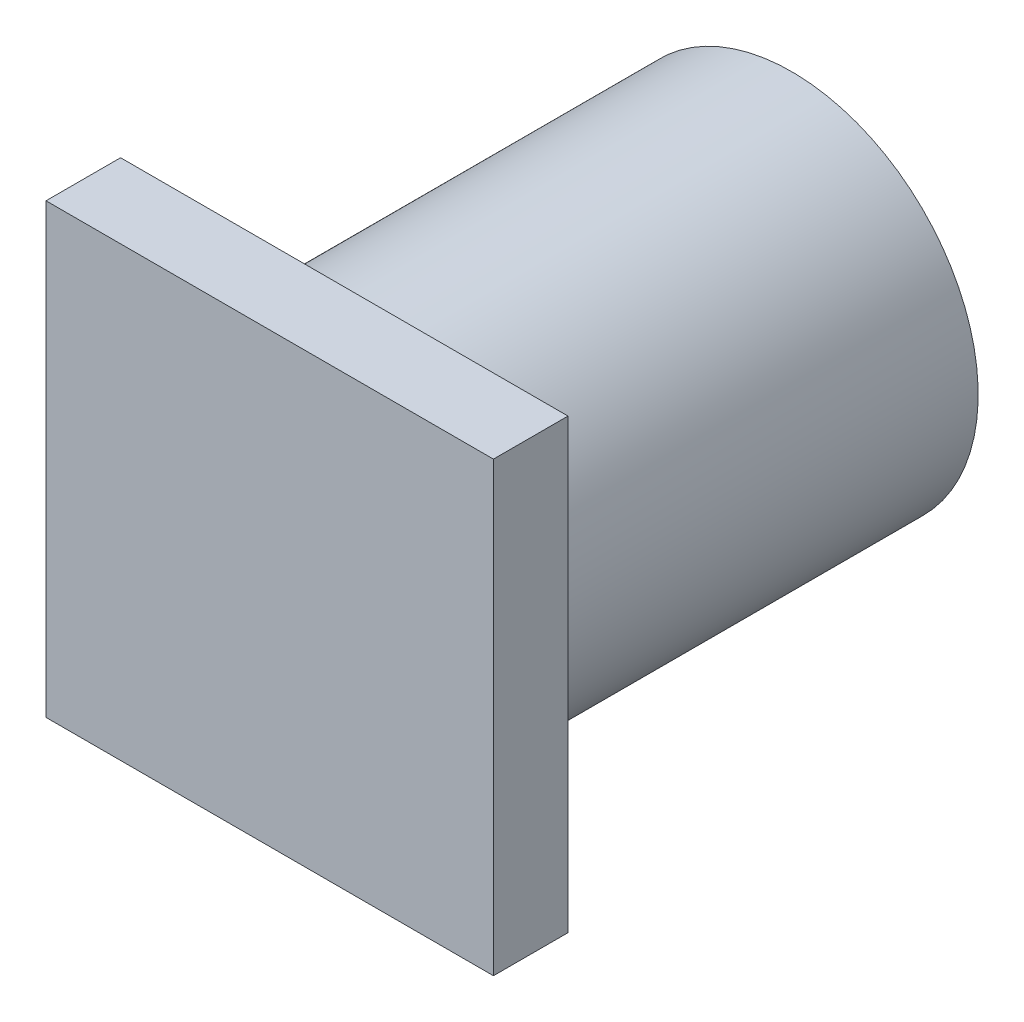
ISO-10303-21;
HEADER;
FILE_DESCRIPTION(('STEP AP214'),'2;1');
FILE_NAME('part.step','',(''),(''),'','','');
FILE_SCHEMA(('AUTOMOTIVE_DESIGN { 1 0 10303 214 1 1 1 1 }'));
ENDSEC;
DATA;
#1=APPLICATION_CONTEXT('core data for automotive mechanical design processes');
#2=APPLICATION_PROTOCOL_DEFINITION('international standard','automotive_design',2000,#1);
#3=PRODUCT_CONTEXT('',#1,'mechanical');
#4=PRODUCT('Part','Part','',(#3));
#5=PRODUCT_RELATED_PRODUCT_CATEGORY('part','',(#4));
#6=PRODUCT_DEFINITION_FORMATION('','',#4);
#7=PRODUCT_DEFINITION_CONTEXT('part definition',#1,'design');
#8=PRODUCT_DEFINITION('design','',#6,#7);
#9=PRODUCT_DEFINITION_SHAPE('','',#8);
#10=(LENGTH_UNIT() NAMED_UNIT(*) SI_UNIT(.MILLI.,.METRE.));
#11=(NAMED_UNIT(*) PLANE_ANGLE_UNIT() SI_UNIT($,.RADIAN.));
#12=(NAMED_UNIT(*) SI_UNIT($,.STERADIAN.) SOLID_ANGLE_UNIT());
#13=UNCERTAINTY_MEASURE_WITH_UNIT(LENGTH_MEASURE(1.E-05),#10,'distance_accuracy_value','');
#14=(GEOMETRIC_REPRESENTATION_CONTEXT(3) GLOBAL_UNCERTAINTY_ASSIGNED_CONTEXT((#13)) GLOBAL_UNIT_ASSIGNED_CONTEXT((#10,
#11,#12)) REPRESENTATION_CONTEXT('',''));
#15=CARTESIAN_POINT('',(0.,0.,0.));
#16=DIRECTION('',(0.,0.,1.));
#17=DIRECTION('',(1.,0.,0.));
#18=AXIS2_PLACEMENT_3D('',#15,#16,#17);
#19=CARTESIAN_POINT('',(6.,-6.,2.));
#20=DIRECTION('',(-1.,0.,0.));
#21=DIRECTION('',(0.,0.,1.));
#22=AXIS2_PLACEMENT_3D('',#19,#20,#21);
#23=PLANE('',#22);
#24=DIRECTION('',(0.,1.,0.));
#25=VECTOR('',#24,1.);
#26=CARTESIAN_POINT('',(6.,-6.,0.));
#27=LINE('',#26,#25);
#28=CARTESIAN_POINT('',(6.,-6.,0.));
#29=VERTEX_POINT('',#28);
#30=CARTESIAN_POINT('',(6.,6.,0.));
#31=VERTEX_POINT('',#30);
#32=EDGE_CURVE('E102',#29,#31,#27,.T.);
#33=ORIENTED_EDGE('',*,*,#32,.T.);
#34=DIRECTION('',(0.,0.,-1.));
#35=VECTOR('',#34,1.);
#36=CARTESIAN_POINT('',(6.,6.,2.));
#37=LINE('',#36,#35);
#38=CARTESIAN_POINT('',(6.,6.,2.));
#39=VERTEX_POINT('',#38);
#40=EDGE_CURVE('E39',#39,#31,#37,.T.);
#41=ORIENTED_EDGE('',*,*,#40,.F.);
#42=DIRECTION('',(0.,1.,0.));
#43=VECTOR('',#42,1.);
#44=CARTESIAN_POINT('',(6.,-6.,2.));
#45=LINE('',#44,#43);
#46=CARTESIAN_POINT('',(6.,-6.,2.));
#47=VERTEX_POINT('',#46);
#48=EDGE_CURVE('E89',#47,#39,#45,.T.);
#49=ORIENTED_EDGE('',*,*,#48,.F.);
#50=DIRECTION('',(0.,0.,-1.));
#51=VECTOR('',#50,1.);
#52=CARTESIAN_POINT('',(6.,-6.,2.));
#53=LINE('',#52,#51);
#54=EDGE_CURVE('E98',#47,#29,#53,.T.);
#55=ORIENTED_EDGE('',*,*,#54,.T.);
#56=EDGE_LOOP('',(#33,#41,#49,#55));
#57=FACE_BOUND('',#56,.T.);
#58=ADVANCED_FACE('F36',(#57),#23,.F.);
#59=CARTESIAN_POINT('',(-6.,6.,2.));
#60=DIRECTION('',(0.,-1.,0.));
#61=DIRECTION('',(0.,0.,-1.));
#62=AXIS2_PLACEMENT_3D('',#59,#60,#61);
#63=PLANE('',#62);
#64=DIRECTION('',(-1.,0.,0.));
#65=VECTOR('',#64,1.);
#66=CARTESIAN_POINT('',(-6.,6.,0.));
#67=LINE('',#66,#65);
#68=CARTESIAN_POINT('',(-6.,6.,0.));
#69=VERTEX_POINT('',#68);
#70=EDGE_CURVE('E94',#31,#69,#67,.T.);
#71=ORIENTED_EDGE('',*,*,#70,.T.);
#72=DIRECTION('',(0.,0.,-1.));
#73=VECTOR('',#72,1.);
#74=CARTESIAN_POINT('',(-6.,6.,2.));
#75=LINE('',#74,#73);
#76=CARTESIAN_POINT('',(-6.,6.,2.));
#77=VERTEX_POINT('',#76);
#78=EDGE_CURVE('E92',#77,#69,#75,.T.);
#79=ORIENTED_EDGE('',*,*,#78,.F.);
#80=DIRECTION('',(-1.,0.,0.));
#81=VECTOR('',#80,1.);
#82=CARTESIAN_POINT('',(-6.,6.,2.));
#83=LINE('',#82,#81);
#84=EDGE_CURVE('E84',#39,#77,#83,.T.);
#85=ORIENTED_EDGE('',*,*,#84,.F.);
#86=ORIENTED_EDGE('',*,*,#40,.T.);
#87=EDGE_LOOP('',(#71,#79,#85,#86));
#88=FACE_BOUND('',#87,.T.);
#89=ADVANCED_FACE('F93',(#88),#63,.F.);
#90=CARTESIAN_POINT('',(-6.,-6.,2.));
#91=DIRECTION('',(1.,0.,0.));
#92=DIRECTION('',(0.,0.,-1.));
#93=AXIS2_PLACEMENT_3D('',#90,#91,#92);
#94=PLANE('',#93);
#95=DIRECTION('',(0.,-1.,0.));
#96=VECTOR('',#95,1.);
#97=CARTESIAN_POINT('',(-6.,-6.,0.));
#98=LINE('',#97,#96);
#99=CARTESIAN_POINT('',(-6.,-6.,0.));
#100=VERTEX_POINT('',#99);
#101=EDGE_CURVE('E70',#69,#100,#98,.T.);
#102=ORIENTED_EDGE('',*,*,#101,.T.);
#103=DIRECTION('',(0.,0.,-1.));
#104=VECTOR('',#103,1.);
#105=CARTESIAN_POINT('',(-6.,-6.,2.));
#106=LINE('',#105,#104);
#107=CARTESIAN_POINT('',(-6.,-6.,2.));
#108=VERTEX_POINT('',#107);
#109=EDGE_CURVE('E95',#108,#100,#106,.T.);
#110=ORIENTED_EDGE('',*,*,#109,.F.);
#111=DIRECTION('',(0.,-1.,0.));
#112=VECTOR('',#111,1.);
#113=CARTESIAN_POINT('',(-6.,-6.,2.));
#114=LINE('',#113,#112);
#115=EDGE_CURVE('E87',#77,#108,#114,.T.);
#116=ORIENTED_EDGE('',*,*,#115,.F.);
#117=ORIENTED_EDGE('',*,*,#78,.T.);
#118=EDGE_LOOP('',(#102,#110,#116,#117));
#119=FACE_BOUND('',#118,.T.);
#120=ADVANCED_FACE('F96',(#119),#94,.F.);
#121=CARTESIAN_POINT('',(-6.,-6.,2.));
#122=DIRECTION('',(0.,1.,0.));
#123=DIRECTION('',(0.,0.,1.));
#124=AXIS2_PLACEMENT_3D('',#121,#122,#123);
#125=PLANE('',#124);
#126=DIRECTION('',(1.,0.,0.));
#127=VECTOR('',#126,1.);
#128=CARTESIAN_POINT('',(-6.,-6.,0.));
#129=LINE('',#128,#127);
#130=EDGE_CURVE('E76',#100,#29,#129,.T.);
#131=ORIENTED_EDGE('',*,*,#130,.T.);
#132=ORIENTED_EDGE('',*,*,#54,.F.);
#133=DIRECTION('',(1.,0.,0.));
#134=VECTOR('',#133,1.);
#135=CARTESIAN_POINT('',(-6.,-6.,2.));
#136=LINE('',#135,#134);
#137=EDGE_CURVE('E53',#108,#47,#136,.T.);
#138=ORIENTED_EDGE('',*,*,#137,.F.);
#139=ORIENTED_EDGE('',*,*,#109,.T.);
#140=EDGE_LOOP('',(#131,#132,#138,#139));
#141=FACE_BOUND('',#140,.T.);
#142=ADVANCED_FACE('F110',(#141),#125,.F.);
#143=CARTESIAN_POINT('',(0.,0.,2.));
#144=DIRECTION('',(0.,0.,-1.));
#145=DIRECTION('',(-1.,0.,0.));
#146=AXIS2_PLACEMENT_3D('',#143,#144,#145);
#147=PLANE('',#146);
#148=ORIENTED_EDGE('',*,*,#48,.T.);
#149=ORIENTED_EDGE('',*,*,#84,.T.);
#150=ORIENTED_EDGE('',*,*,#115,.T.);
#151=ORIENTED_EDGE('',*,*,#137,.T.);
#152=EDGE_LOOP('',(#148,#149,#150,#151));
#153=FACE_BOUND('',#152,.T.);
#154=ADVANCED_FACE('F85',(#153),#147,.F.);
#155=CARTESIAN_POINT('',(0.,0.,0.));
#156=DIRECTION('',(0.,0.,-1.));
#157=DIRECTION('',(-1.,0.,0.));
#158=AXIS2_PLACEMENT_3D('',#155,#156,#157);
#159=PLANE('',#158);
#160=CARTESIAN_POINT('',(0.,0.,0.));
#161=DIRECTION('',(0.,0.,-1.));
#162=DIRECTION('',(-1.,0.,0.));
#163=AXIS2_PLACEMENT_3D('',#160,#161,#162);
#164=CIRCLE('',#163,5.);
#165=CARTESIAN_POINT('',(-5.,0.,0.));
#166=VERTEX_POINT('',#165);
#167=EDGE_CURVE('E11',#166,#166,#164,.T.);
#168=ORIENTED_EDGE('',*,*,#167,.F.);
#169=EDGE_LOOP('',(#168));
#170=FACE_BOUND('',#169,.T.);
#171=ORIENTED_EDGE('',*,*,#32,.F.);
#172=ORIENTED_EDGE('',*,*,#130,.F.);
#173=ORIENTED_EDGE('',*,*,#101,.F.);
#174=ORIENTED_EDGE('',*,*,#70,.F.);
#175=EDGE_LOOP('',(#171,#172,#173,#174));
#176=FACE_BOUND('',#175,.T.);
#177=ADVANCED_FACE('F113',(#170,#176),#159,.T.);
#178=CARTESIAN_POINT('',(0.,0.,-12.));
#179=DIRECTION('',(0.,0.,1.));
#180=DIRECTION('',(1.,0.,0.));
#181=AXIS2_PLACEMENT_3D('',#178,#179,#180);
#182=CYLINDRICAL_SURFACE('',#181,5.);
#183=CARTESIAN_POINT('',(0.,0.,-12.));
#184=DIRECTION('',(0.,0.,-1.));
#185=DIRECTION('',(-1.,0.,0.));
#186=AXIS2_PLACEMENT_3D('',#183,#184,#185);
#187=CIRCLE('',#186,5.);
#188=CARTESIAN_POINT('',(-5.,0.,-12.));
#189=VERTEX_POINT('',#188);
#190=EDGE_CURVE('E105',#189,#189,#187,.T.);
#191=ORIENTED_EDGE('',*,*,#190,.F.);
#192=EDGE_LOOP('',(#191));
#193=FACE_BOUND('',#192,.T.);
#194=ORIENTED_EDGE('',*,*,#167,.T.);
#195=EDGE_LOOP('',(#194));
#196=FACE_BOUND('',#195,.T.);
#197=ADVANCED_FACE('F121',(#193,#196),#182,.T.);
#198=CARTESIAN_POINT('',(0.,0.,-12.));
#199=DIRECTION('',(0.,0.,-1.));
#200=DIRECTION('',(-1.,0.,0.));
#201=AXIS2_PLACEMENT_3D('',#198,#199,#200);
#202=PLANE('',#201);
#203=ORIENTED_EDGE('',*,*,#190,.T.);
#204=EDGE_LOOP('',(#203));
#205=FACE_BOUND('',#204,.T.);
#206=ADVANCED_FACE('F119',(#205),#202,.T.);
#207=CLOSED_SHELL('',(#58,#89,#120,#142,#154,#177,#197,#206));
#208=MANIFOLD_SOLID_BREP('B2',#207);
#209=ADVANCED_BREP_SHAPE_REPRESENTATION('',(#18,#208),#14);
#210=SHAPE_DEFINITION_REPRESENTATION(#9,#209);
ENDSEC;
END-ISO-10303-21;
